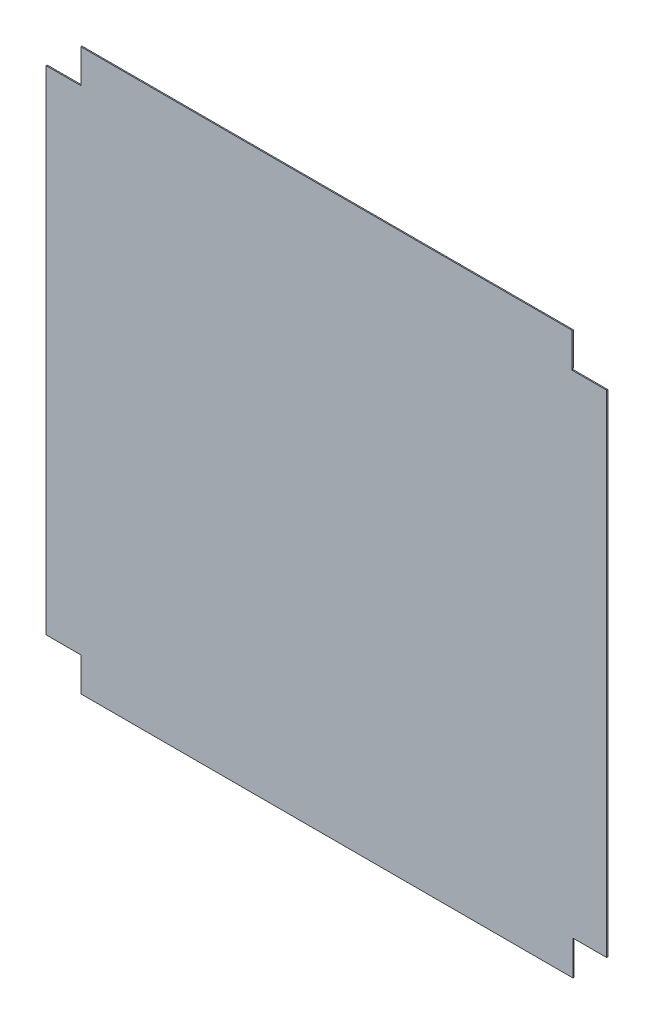
ISO-10303-21;
HEADER;
FILE_DESCRIPTION(('STEP AP214'),'2;1');
FILE_NAME('part.step','',(''),(''),'','','');
FILE_SCHEMA(('AUTOMOTIVE_DESIGN { 1 0 10303 214 1 1 1 1 }'));
ENDSEC;
DATA;
#1=APPLICATION_CONTEXT('core data for automotive mechanical design processes');
#2=APPLICATION_PROTOCOL_DEFINITION('international standard','automotive_design',2000,#1);
#3=PRODUCT_CONTEXT('',#1,'mechanical');
#4=PRODUCT('Part','Part','',(#3));
#5=PRODUCT_RELATED_PRODUCT_CATEGORY('part','',(#4));
#6=PRODUCT_DEFINITION_FORMATION('','',#4);
#7=PRODUCT_DEFINITION_CONTEXT('part definition',#1,'design');
#8=PRODUCT_DEFINITION('design','',#6,#7);
#9=PRODUCT_DEFINITION_SHAPE('','',#8);
#10=(LENGTH_UNIT() NAMED_UNIT(*) SI_UNIT(.MILLI.,.METRE.));
#11=(NAMED_UNIT(*) PLANE_ANGLE_UNIT() SI_UNIT($,.RADIAN.));
#12=(NAMED_UNIT(*) SI_UNIT($,.STERADIAN.) SOLID_ANGLE_UNIT());
#13=UNCERTAINTY_MEASURE_WITH_UNIT(LENGTH_MEASURE(1.E-05),#10,'distance_accuracy_value','');
#14=(GEOMETRIC_REPRESENTATION_CONTEXT(3) GLOBAL_UNCERTAINTY_ASSIGNED_CONTEXT((#13)) GLOBAL_UNIT_ASSIGNED_CONTEXT((#10,
#11,#12)) REPRESENTATION_CONTEXT('',''));
#15=CARTESIAN_POINT('',(0.,0.,0.));
#16=DIRECTION('',(0.,0.,1.));
#17=DIRECTION('',(1.,0.,0.));
#18=AXIS2_PLACEMENT_3D('',#15,#16,#17);
#19=CARTESIAN_POINT('',(0.,0.,-1.));
#20=DIRECTION('',(0.,0.,1.));
#21=DIRECTION('',(1.,0.,0.));
#22=AXIS2_PLACEMENT_3D('',#19,#20,#21);
#23=PLANE('',#22);
#24=DIRECTION('',(-0.0151817906491979,-0.999884749975058,0.));
#25=VECTOR('',#24,1.);
#26=CARTESIAN_POINT('',(221.792893218813,223.705846737715,-1.00000000000007));
#27=LINE('',#26,#25);
#28=CARTESIAN_POINT('',(221.792893218813,223.705846737715,-1.00000000000007));
#29=VERTEX_POINT('',#28);
#30=CARTESIAN_POINT('',(221.7634,221.7634,-0.99999999999997));
#31=VERTEX_POINT('',#30);
#32=EDGE_CURVE('E308',#29,#31,#27,.T.);
#33=ORIENTED_EDGE('',*,*,#32,.T.);
#34=CARTESIAN_POINT('',(221.792893218813,221.792893218813,-0.999999999999905));
#35=CARTESIAN_POINT('',(221.7634,221.7634,-1.));
#36=B_SPLINE_CURVE_WITH_KNOTS('',1,(#34,#35),.UNSPECIFIED.,.F.,.F.,(2,2),(0.,
0.0107021136878942),.UNSPECIFIED.);
#37=CARTESIAN_POINT('',(221.792893218813,221.792893218813,-0.999999999999905));
#38=VERTEX_POINT('',#37);
#39=EDGE_CURVE('E250',#38,#31,#36,.T.);
#40=ORIENTED_EDGE('',*,*,#39,.F.);
#41=CARTESIAN_POINT('',(223.705846737715,221.792893218813,-0.999999999999904));
#42=CARTESIAN_POINT('',(221.792893218813,221.792893218813,-0.999999999999905));
#43=B_SPLINE_CURVE_WITH_KNOTS('',1,(#41,#42),.UNSPECIFIED.,.F.,.F.,(2,2),(0.509163549271259,1.),.UNSPECIFIED.);
#44=CARTESIAN_POINT('',(223.705846737715,221.792893218813,-0.999999999999973));
#45=VERTEX_POINT('',#44);
#46=EDGE_CURVE('E241',#45,#38,#43,.T.);
#47=ORIENTED_EDGE('',*,*,#46,.F.);
#48=DIRECTION('',(1.,0.,0.));
#49=VECTOR('',#48,1.);
#50=CARTESIAN_POINT('',(222.969246737715,221.792893218813,-0.999999999999973));
#51=LINE('',#50,#49);
#52=CARTESIAN_POINT('',(252.969246737715,221.792893218814,-0.999999999999862));
#53=VERTEX_POINT('',#52);
#54=EDGE_CURVE('E323',#45,#53,#51,.T.);
#55=ORIENTED_EDGE('',*,*,#54,.T.);
#56=DIRECTION('',(0.,1.,0.));
#57=VECTOR('',#56,1.);
#58=CARTESIAN_POINT('',(252.969246737715,222.5,-0.999999999999779));
#59=LINE('',#58,#57);
#60=CARTESIAN_POINT('',(252.969246737714,-221.7634,-0.999999999999862));
#61=VERTEX_POINT('',#60);
#62=EDGE_CURVE('E326',#61,#53,#59,.T.);
#63=ORIENTED_EDGE('',*,*,#62,.F.);
#64=DIRECTION('',(-1.,0.,0.));
#65=VECTOR('',#64,1.);
#66=CARTESIAN_POINT('',(223.705846737715,-221.7634,-1.00000000000004));
#67=LINE('',#66,#65);
#68=CARTESIAN_POINT('',(222.5,-221.7634,-1.00000000000004));
#69=VERTEX_POINT('',#68);
#70=EDGE_CURVE('E394',#61,#69,#67,.T.);
#71=ORIENTED_EDGE('',*,*,#70,.T.);
#72=DIRECTION('',(0.,-1.,0.));
#73=VECTOR('',#72,1.);
#74=CARTESIAN_POINT('',(222.5,-221.7634,-1.00000000000004));
#75=LINE('',#74,#73);
#76=CARTESIAN_POINT('',(222.5,-252.969246737715,-0.999999999999807));
#77=VERTEX_POINT('',#76);
#78=EDGE_CURVE('E369',#69,#77,#75,.T.);
#79=ORIENTED_EDGE('',*,*,#78,.T.);
#80=DIRECTION('',(1.,0.,0.));
#81=VECTOR('',#80,1.);
#82=CARTESIAN_POINT('',(222.5,-252.969246737715,-0.999999999999807));
#83=LINE('',#82,#81);
#84=CARTESIAN_POINT('',(-221.7634,-252.969246737715,-0.999999999999751));
#85=VERTEX_POINT('',#84);
#86=EDGE_CURVE('E375',#85,#77,#83,.T.);
#87=ORIENTED_EDGE('',*,*,#86,.F.);
#88=DIRECTION('',(0.,1.,0.));
#89=VECTOR('',#88,1.);
#90=CARTESIAN_POINT('',(-221.7634,-223.705846737715,-1.00000000000004));
#91=LINE('',#90,#89);
#92=CARTESIAN_POINT('',(-221.7634,-222.5,-1.00000000000007));
#93=VERTEX_POINT('',#92);
#94=EDGE_CURVE('E360',#85,#93,#91,.T.);
#95=ORIENTED_EDGE('',*,*,#94,.T.);
#96=DIRECTION('',(-1.,0.,0.));
#97=VECTOR('',#96,1.);
#98=CARTESIAN_POINT('',(-221.7634,-222.5,-1.00000000000007));
#99=LINE('',#98,#97);
#100=CARTESIAN_POINT('',(-252.969246737715,-222.5,-0.999999999999862));
#101=VERTEX_POINT('',#100);
#102=EDGE_CURVE('E342',#93,#101,#99,.T.);
#103=ORIENTED_EDGE('',*,*,#102,.T.);
#104=DIRECTION('',(0.,-1.,0.));
#105=VECTOR('',#104,1.);
#106=CARTESIAN_POINT('',(-252.969246737715,-222.5,-0.999999999999862));
#107=LINE('',#106,#105);
#108=CARTESIAN_POINT('',(-252.969246737715,222.5,-0.999999999999862));
#109=VERTEX_POINT('',#108);
#110=EDGE_CURVE('E245',#109,#101,#107,.T.);
#111=ORIENTED_EDGE('',*,*,#110,.F.);
#112=DIRECTION('',(1.,0.,0.));
#113=VECTOR('',#112,1.);
#114=CARTESIAN_POINT('',(-223.705846737714,222.5,-1.00000000000007));
#115=LINE('',#114,#113);
#116=CARTESIAN_POINT('',(-221.7634,222.5,-1.00000000000007));
#117=VERTEX_POINT('',#116);
#118=EDGE_CURVE('E256',#109,#117,#115,.T.);
#119=ORIENTED_EDGE('',*,*,#118,.T.);
#120=DIRECTION('',(0.,1.,0.));
#121=VECTOR('',#120,1.);
#122=CARTESIAN_POINT('',(-221.7634,221.7634,-1.00000000000007));
#123=LINE('',#122,#121);
#124=CARTESIAN_POINT('',(-221.7634,252.969246737715,-0.99999999999989));
#125=VERTEX_POINT('',#124);
#126=EDGE_CURVE('E315',#117,#125,#123,.T.);
#127=ORIENTED_EDGE('',*,*,#126,.T.);
#128=DIRECTION('',(-1.,0.,0.));
#129=VECTOR('',#128,1.);
#130=CARTESIAN_POINT('',(-221.7634,252.969246737715,-0.99999999999989));
#131=LINE('',#130,#129);
#132=CARTESIAN_POINT('',(221.792893218813,252.969246737715,-0.999999999999696));
#133=VERTEX_POINT('',#132);
#134=EDGE_CURVE('E405',#133,#125,#131,.T.);
#135=ORIENTED_EDGE('',*,*,#134,.F.);
#136=DIRECTION('',(0.,1.,0.));
#137=VECTOR('',#136,1.);
#138=CARTESIAN_POINT('',(221.792893218813,222.969246737715,-0.99999999999989));
#139=LINE('',#138,#137);
#140=EDGE_CURVE('E413',#29,#133,#139,.T.);
#141=ORIENTED_EDGE('',*,*,#140,.F.);
#142=EDGE_LOOP('',(#33,#40,#47,#55,#63,#71,#79,#87,#95,#103,#111,#119,#127,#135,#141));
#143=FACE_BOUND('',#142,.T.);
#144=ADVANCED_FACE('F116',(#143),#23,.F.);
#145=CARTESIAN_POINT('',(0.,0.,0.));
#146=DIRECTION('',(0.,0.,1.));
#147=DIRECTION('',(1.,0.,0.));
#148=AXIS2_PLACEMENT_3D('',#145,#146,#147);
#149=PLANE('',#148);
#150=CARTESIAN_POINT('',(221.792893218813,221.792893218813,0.));
#151=CARTESIAN_POINT('',(221.7634,221.7634,0.));
#152=B_SPLINE_CURVE_WITH_KNOTS('',1,(#150,#151),.UNSPECIFIED.,.F.,.F.,(2,2),(0.,
0.0107021136878942),.UNSPECIFIED.);
#153=CARTESIAN_POINT('',(221.792893218813,221.792893218813,0.));
#154=VERTEX_POINT('',#153);
#155=CARTESIAN_POINT('',(221.7634,221.7634,0.));
#156=VERTEX_POINT('',#155);
#157=EDGE_CURVE('E231',#154,#156,#152,.T.);
#158=ORIENTED_EDGE('',*,*,#157,.T.);
#159=DIRECTION('',(-0.0151817906491979,-0.999884749975058,0.));
#160=VECTOR('',#159,1.);
#161=CARTESIAN_POINT('',(221.792893218813,223.705846737715,0.));
#162=LINE('',#161,#160);
#163=CARTESIAN_POINT('',(221.792893218813,223.705846737715,0.));
#164=VERTEX_POINT('',#163);
#165=EDGE_CURVE('E318',#164,#156,#162,.T.);
#166=ORIENTED_EDGE('',*,*,#165,.F.);
#167=DIRECTION('',(0.,1.,0.));
#168=VECTOR('',#167,1.);
#169=CARTESIAN_POINT('',(221.792893218813,221.969246737714,0.));
#170=LINE('',#169,#168);
#171=CARTESIAN_POINT('',(221.792893218813,252.969246737715,3.05311331771918E-13));
#172=VERTEX_POINT('',#171);
#173=EDGE_CURVE('E401',#164,#172,#170,.T.);
#174=ORIENTED_EDGE('',*,*,#173,.T.);
#175=DIRECTION('',(-1.,0.,0.));
#176=VECTOR('',#175,1.);
#177=CARTESIAN_POINT('',(-221.7634,252.969246737715,1.11022302462516E-13));
#178=LINE('',#177,#176);
#179=CARTESIAN_POINT('',(-221.7634,252.969246737715,1.11022302462516E-13));
#180=VERTEX_POINT('',#179);
#181=EDGE_CURVE('E398',#172,#180,#178,.T.);
#182=ORIENTED_EDGE('',*,*,#181,.T.);
#183=DIRECTION('',(0.,1.,0.));
#184=VECTOR('',#183,1.);
#185=CARTESIAN_POINT('',(-221.7634,222.734623368857,0.));
#186=LINE('',#185,#184);
#187=CARTESIAN_POINT('',(-221.7634,222.5,0.));
#188=VERTEX_POINT('',#187);
#189=EDGE_CURVE('E320',#188,#180,#186,.T.);
#190=ORIENTED_EDGE('',*,*,#189,.F.);
#191=DIRECTION('',(-1.,0.,0.));
#192=VECTOR('',#191,1.);
#193=CARTESIAN_POINT('',(-222.734623368857,222.5,-8.38738800634786E-12));
#194=LINE('',#193,#192);
#195=CARTESIAN_POINT('',(-252.969246737715,222.5,1.38777878078145E-13));
#196=VERTEX_POINT('',#195);
#197=EDGE_CURVE('E133',#196,#188,#194,.F.);
#198=ORIENTED_EDGE('',*,*,#197,.F.);
#199=DIRECTION('',(0.,-1.,0.));
#200=VECTOR('',#199,1.);
#201=CARTESIAN_POINT('',(-252.969246737715,-222.5,1.38777878078145E-13));
#202=LINE('',#201,#200);
#203=CARTESIAN_POINT('',(-252.969246737715,-222.5,1.38777878078145E-13));
#204=VERTEX_POINT('',#203);
#205=EDGE_CURVE('E350',#196,#204,#202,.T.);
#206=ORIENTED_EDGE('',*,*,#205,.T.);
#207=DIRECTION('',(-1.,0.,0.));
#208=VECTOR('',#207,1.);
#209=CARTESIAN_POINT('',(-222.734623368857,-222.5,-8.38738800634786E-12));
#210=LINE('',#209,#208);
#211=CARTESIAN_POINT('',(-221.7634,-222.5,-8.38738800634786E-12));
#212=VERTEX_POINT('',#211);
#213=EDGE_CURVE('E340',#212,#204,#210,.T.);
#214=ORIENTED_EDGE('',*,*,#213,.F.);
#215=DIRECTION('',(0.,1.,0.));
#216=VECTOR('',#215,1.);
#217=CARTESIAN_POINT('',(-221.7634,-222.734623368857,-1.3389896830196E-12));
#218=LINE('',#217,#216);
#219=CARTESIAN_POINT('',(-221.7634,-252.969246737715,2.4980018054066E-13));
#220=VERTEX_POINT('',#219);
#221=EDGE_CURVE('E347',#220,#212,#218,.T.);
#222=ORIENTED_EDGE('',*,*,#221,.F.);
#223=DIRECTION('',(1.,0.,0.));
#224=VECTOR('',#223,1.);
#225=CARTESIAN_POINT('',(222.5,-252.969246737715,1.94289029309402E-13));
#226=LINE('',#225,#224);
#227=CARTESIAN_POINT('',(222.5,-252.969246737715,1.94289029309402E-13));
#228=VERTEX_POINT('',#227);
#229=EDGE_CURVE('E358',#220,#228,#226,.T.);
#230=ORIENTED_EDGE('',*,*,#229,.T.);
#231=DIRECTION('',(0.,1.,0.));
#232=VECTOR('',#231,1.);
#233=CARTESIAN_POINT('',(222.5,-222.734623368857,-1.3389896830196E-12));
#234=LINE('',#233,#232);
#235=CARTESIAN_POINT('',(222.5,-221.7634,-1.3389896830196E-12));
#236=VERTEX_POINT('',#235);
#237=EDGE_CURVE('E357',#236,#228,#234,.F.);
#238=ORIENTED_EDGE('',*,*,#237,.F.);
#239=DIRECTION('',(-1.,0.,0.));
#240=VECTOR('',#239,1.);
#241=CARTESIAN_POINT('',(222.734623368857,-221.7634,0.));
#242=LINE('',#241,#240);
#243=CARTESIAN_POINT('',(252.969246737714,-221.7634,1.38777878078145E-13));
#244=VERTEX_POINT('',#243);
#245=EDGE_CURVE('E397',#244,#236,#242,.T.);
#246=ORIENTED_EDGE('',*,*,#245,.F.);
#247=DIRECTION('',(0.,1.,0.));
#248=VECTOR('',#247,1.);
#249=CARTESIAN_POINT('',(252.969246737715,222.5,2.22044604925031E-13));
#250=LINE('',#249,#248);
#251=CARTESIAN_POINT('',(252.969246737715,221.792893218814,1.94289029309402E-13));
#252=VERTEX_POINT('',#251);
#253=EDGE_CURVE('E370',#244,#252,#250,.T.);
#254=ORIENTED_EDGE('',*,*,#253,.T.);
#255=DIRECTION('',(1.,0.,0.));
#256=VECTOR('',#255,1.);
#257=CARTESIAN_POINT('',(221.969246737712,221.792893218813,0.));
#258=LINE('',#257,#256);
#259=CARTESIAN_POINT('',(223.705846737715,221.792893218813,0.));
#260=VERTEX_POINT('',#259);
#261=EDGE_CURVE('E234',#260,#252,#258,.T.);
#262=ORIENTED_EDGE('',*,*,#261,.F.);
#263=CARTESIAN_POINT('',(223.705846737715,221.792893218813,0.));
#264=CARTESIAN_POINT('',(221.792893218813,221.792893218813,0.));
#265=B_SPLINE_CURVE_WITH_KNOTS('',1,(#263,#264),.UNSPECIFIED.,.F.,.F.,(2,2),(0.509163549271259,
1.),.UNSPECIFIED.);
#266=EDGE_CURVE('E227',#260,#154,#265,.T.);
#267=ORIENTED_EDGE('',*,*,#266,.T.);
#268=EDGE_LOOP('',(#158,#166,#174,#182,#190,#198,#206,#214,#222,#230,#238,#246,#254,#262,#267));
#269=FACE_BOUND('',#268,.T.);
#270=ADVANCED_FACE('F118',(#269),#149,.T.);
#271=CARTESIAN_POINT('',(-221.7634,221.7634,-1.00000000000007));
#272=DIRECTION('',(-1.,0.,0.));
#273=DIRECTION('',(0.,1.,0.));
#274=AXIS2_PLACEMENT_3D('',#271,#272,#273);
#275=PLANE('',#274);
#276=ORIENTED_EDGE('',*,*,#126,.F.);
#277=DIRECTION('',(0.,0.,1.));
#278=VECTOR('',#277,1.);
#279=CARTESIAN_POINT('',(-221.7634,222.5,-1.));
#280=LINE('',#279,#278);
#281=EDGE_CURVE('E13',#117,#188,#280,.T.);
#282=ORIENTED_EDGE('',*,*,#281,.T.);
#283=ORIENTED_EDGE('',*,*,#189,.T.);
#284=DIRECTION('',(0.,0.,-1.));
#285=VECTOR('',#284,1.);
#286=CARTESIAN_POINT('',(-221.7634,252.969246737715,1.11022302462516E-13));
#287=LINE('',#286,#285);
#288=EDGE_CURVE('E402',#180,#125,#287,.T.);
#289=ORIENTED_EDGE('',*,*,#288,.T.);
#290=EDGE_LOOP('',(#276,#282,#283,#289));
#291=FACE_BOUND('',#290,.T.);
#292=ADVANCED_FACE('F290',(#291),#275,.T.);
#293=CARTESIAN_POINT('',(221.792893218813,223.705846737715,-1.00000000000007));
#294=DIRECTION('',(0.999884749975058,-0.0151817906491979,0.));
#295=DIRECTION('',(0.,0.,1.));
#296=AXIS2_PLACEMENT_3D('',#293,#294,#295);
#297=PLANE('',#296);
#298=ORIENTED_EDGE('',*,*,#165,.T.);
#299=DIRECTION('',(0.,0.,1.));
#300=VECTOR('',#299,1.);
#301=CARTESIAN_POINT('',(221.7634,221.7634,-1.00000000000007));
#302=LINE('',#301,#300);
#303=EDGE_CURVE('E120',#156,#31,#302,.F.);
#304=ORIENTED_EDGE('',*,*,#303,.T.);
#305=ORIENTED_EDGE('',*,*,#32,.F.);
#306=CARTESIAN_POINT('',(221.792893218813,223.705846737715,0.));
#307=DIRECTION('',(0.,0.,-1.));
#308=VECTOR('',#307,1.);
#309=LINE('',#306,#308);
#310=EDGE_CURVE('E141',#164,#29,#309,.T.);
#311=ORIENTED_EDGE('',*,*,#310,.F.);
#312=EDGE_LOOP('',(#298,#304,#305,#311));
#313=FACE_BOUND('',#312,.T.);
#314=ADVANCED_FACE('F280',(#313),#297,.T.);
#315=CARTESIAN_POINT('',(-221.7634,252.969246737715,1.11022302462516E-13));
#316=DIRECTION('',(0.,-1.,0.));
#317=DIRECTION('',(0.,0.,-1.));
#318=AXIS2_PLACEMENT_3D('',#315,#316,#317);
#319=PLANE('',#318);
#320=ORIENTED_EDGE('',*,*,#181,.F.);
#321=DIRECTION('',(0.,0.,-1.));
#322=VECTOR('',#321,1.);
#323=CARTESIAN_POINT('',(221.792893218813,252.969246737715,1.11022302462516E-13));
#324=LINE('',#323,#322);
#325=EDGE_CURVE('E396',#172,#133,#324,.T.);
#326=ORIENTED_EDGE('',*,*,#325,.T.);
#327=ORIENTED_EDGE('',*,*,#134,.T.);
#328=ORIENTED_EDGE('',*,*,#288,.F.);
#329=EDGE_LOOP('',(#320,#326,#327,#328));
#330=FACE_BOUND('',#329,.T.);
#331=ADVANCED_FACE('F289',(#330),#319,.F.);
#332=CARTESIAN_POINT('',(221.792893218813,222.969246737715,-0.99999999999989));
#333=DIRECTION('',(-1.,0.,0.));
#334=DIRECTION('',(0.,-1.,0.));
#335=AXIS2_PLACEMENT_3D('',#332,#333,#334);
#336=PLANE('',#335);
#337=ORIENTED_EDGE('',*,*,#325,.F.);
#338=ORIENTED_EDGE('',*,*,#173,.F.);
#339=ORIENTED_EDGE('',*,*,#310,.T.);
#340=ORIENTED_EDGE('',*,*,#140,.T.);
#341=EDGE_LOOP('',(#337,#338,#339,#340));
#342=FACE_BOUND('',#341,.T.);
#343=ADVANCED_FACE('F297',(#342),#336,.F.);
#344=CARTESIAN_POINT('',(223.705846737715,-221.7634,-1.00000000000004));
#345=DIRECTION('',(0.,-1.,0.));
#346=DIRECTION('',(-1.,0.,0.));
#347=AXIS2_PLACEMENT_3D('',#344,#345,#346);
#348=PLANE('',#347);
#349=DIRECTION('',(0.,0.,1.));
#350=VECTOR('',#349,1.);
#351=CARTESIAN_POINT('',(222.5,-221.7634,-1.00000000000003));
#352=LINE('',#351,#350);
#353=EDGE_CURVE('E329',#69,#236,#352,.T.);
#354=ORIENTED_EDGE('',*,*,#353,.F.);
#355=ORIENTED_EDGE('',*,*,#70,.F.);
#356=DIRECTION('',(0.,0.,-1.));
#357=VECTOR('',#356,1.);
#358=CARTESIAN_POINT('',(252.969246737714,-221.7634,1.38777878078145E-13));
#359=LINE('',#358,#357);
#360=EDGE_CURVE('E377',#244,#61,#359,.T.);
#361=ORIENTED_EDGE('',*,*,#360,.F.);
#362=ORIENTED_EDGE('',*,*,#245,.T.);
#363=EDGE_LOOP('',(#354,#355,#361,#362));
#364=FACE_BOUND('',#363,.T.);
#365=ADVANCED_FACE('F301',(#364),#348,.T.);
#366=CARTESIAN_POINT('',(252.969246737715,222.5,2.22044604925031E-13));
#367=DIRECTION('',(-1.,0.,0.));
#368=DIRECTION('',(0.,0.,1.));
#369=AXIS2_PLACEMENT_3D('',#366,#367,#368);
#370=PLANE('',#369);
#371=DIRECTION('',(0.,0.,-1.));
#372=VECTOR('',#371,1.);
#373=CARTESIAN_POINT('',(252.969246737715,221.792893218814,2.22044604925031E-13));
#374=LINE('',#373,#372);
#375=EDGE_CURVE('E328',#252,#53,#374,.T.);
#376=ORIENTED_EDGE('',*,*,#375,.F.);
#377=ORIENTED_EDGE('',*,*,#253,.F.);
#378=ORIENTED_EDGE('',*,*,#360,.T.);
#379=ORIENTED_EDGE('',*,*,#62,.T.);
#380=EDGE_LOOP('',(#376,#377,#378,#379));
#381=FACE_BOUND('',#380,.T.);
#382=ADVANCED_FACE('F425',(#381),#370,.F.);
#383=CARTESIAN_POINT('',(222.969246737715,221.792893218813,-0.999999999999973));
#384=DIRECTION('',(0.,1.,0.));
#385=DIRECTION('',(-1.,0.,0.));
#386=AXIS2_PLACEMENT_3D('',#383,#384,#385);
#387=PLANE('',#386);
#388=ORIENTED_EDGE('',*,*,#261,.T.);
#389=ORIENTED_EDGE('',*,*,#375,.T.);
#390=ORIENTED_EDGE('',*,*,#54,.F.);
#391=ORIENTED_EDGE('',*,*,#46,.T.);
#392=DIRECTION('',(0.,0.,-1.));
#393=VECTOR('',#392,1.);
#394=CARTESIAN_POINT('',(221.792893218813,221.792893218813,0.));
#395=LINE('',#394,#393);
#396=EDGE_CURVE('E236',#154,#38,#395,.T.);
#397=ORIENTED_EDGE('',*,*,#396,.F.);
#398=ORIENTED_EDGE('',*,*,#266,.F.);
#399=EDGE_LOOP('',(#388,#389,#390,#391,#397,#398));
#400=FACE_BOUND('',#399,.T.);
#401=ADVANCED_FACE('F239',(#400),#387,.T.);
#402=CARTESIAN_POINT('',(-221.7634,-223.705846737715,-1.00000000000004));
#403=DIRECTION('',(-1.,0.,0.));
#404=DIRECTION('',(0.,1.,0.));
#405=AXIS2_PLACEMENT_3D('',#402,#403,#404);
#406=PLANE('',#405);
#407=DIRECTION('',(0.,0.,1.));
#408=VECTOR('',#407,1.);
#409=CARTESIAN_POINT('',(-221.7634,-222.5,-1.));
#410=LINE('',#409,#408);
#411=EDGE_CURVE('E125',#93,#212,#410,.T.);
#412=ORIENTED_EDGE('',*,*,#411,.F.);
#413=ORIENTED_EDGE('',*,*,#94,.F.);
#414=DIRECTION('',(0.,0.,-1.));
#415=VECTOR('',#414,1.);
#416=CARTESIAN_POINT('',(-221.7634,-252.969246737715,2.4980018054066E-13));
#417=LINE('',#416,#415);
#418=EDGE_CURVE('E356',#220,#85,#417,.T.);
#419=ORIENTED_EDGE('',*,*,#418,.F.);
#420=ORIENTED_EDGE('',*,*,#221,.T.);
#421=EDGE_LOOP('',(#412,#413,#419,#420));
#422=FACE_BOUND('',#421,.T.);
#423=ADVANCED_FACE('F354',(#422),#406,.T.);
#424=CARTESIAN_POINT('',(222.5,-221.7634,-1.00000000000004));
#425=DIRECTION('',(1.,0.,0.));
#426=DIRECTION('',(0.,-1.,0.));
#427=AXIS2_PLACEMENT_3D('',#424,#425,#426);
#428=PLANE('',#427);
#429=ORIENTED_EDGE('',*,*,#353,.T.);
#430=ORIENTED_EDGE('',*,*,#237,.T.);
#431=DIRECTION('',(0.,0.,-1.));
#432=VECTOR('',#431,1.);
#433=CARTESIAN_POINT('',(222.5,-252.969246737715,1.94289029309402E-13));
#434=LINE('',#433,#432);
#435=EDGE_CURVE('E362',#228,#77,#434,.T.);
#436=ORIENTED_EDGE('',*,*,#435,.T.);
#437=ORIENTED_EDGE('',*,*,#78,.F.);
#438=EDGE_LOOP('',(#429,#430,#436,#437));
#439=FACE_BOUND('',#438,.T.);
#440=ADVANCED_FACE('F431',(#439),#428,.T.);
#441=CARTESIAN_POINT('',(222.5,-252.969246737715,1.94289029309402E-13));
#442=DIRECTION('',(0.,1.,0.));
#443=DIRECTION('',(0.,0.,1.));
#444=AXIS2_PLACEMENT_3D('',#441,#442,#443);
#445=PLANE('',#444);
#446=ORIENTED_EDGE('',*,*,#86,.T.);
#447=ORIENTED_EDGE('',*,*,#435,.F.);
#448=ORIENTED_EDGE('',*,*,#229,.F.);
#449=ORIENTED_EDGE('',*,*,#418,.T.);
#450=EDGE_LOOP('',(#446,#447,#448,#449));
#451=FACE_BOUND('',#450,.T.);
#452=ADVANCED_FACE('F435',(#451),#445,.F.);
#453=CARTESIAN_POINT('',(-223.705846737714,222.5,-1.00000000000007));
#454=DIRECTION('',(0.,1.,0.));
#455=DIRECTION('',(1.,0.,0.));
#456=AXIS2_PLACEMENT_3D('',#453,#454,#455);
#457=PLANE('',#456);
#458=ORIENTED_EDGE('',*,*,#118,.F.);
#459=DIRECTION('',(0.,0.,-1.));
#460=VECTOR('',#459,1.);
#461=CARTESIAN_POINT('',(-252.969246737715,222.5,1.38777878078145E-13));
#462=LINE('',#461,#460);
#463=EDGE_CURVE('E442',#196,#109,#462,.T.);
#464=ORIENTED_EDGE('',*,*,#463,.F.);
#465=ORIENTED_EDGE('',*,*,#197,.T.);
#466=ORIENTED_EDGE('',*,*,#281,.F.);
#467=EDGE_LOOP('',(#458,#464,#465,#466));
#468=FACE_BOUND('',#467,.T.);
#469=ADVANCED_FACE('F452',(#468),#457,.T.);
#470=CARTESIAN_POINT('',(-221.7634,-222.5,-1.00000000000007));
#471=DIRECTION('',(0.,-1.,0.));
#472=DIRECTION('',(-1.,0.,0.));
#473=AXIS2_PLACEMENT_3D('',#470,#471,#472);
#474=PLANE('',#473);
#475=ORIENTED_EDGE('',*,*,#411,.T.);
#476=ORIENTED_EDGE('',*,*,#213,.T.);
#477=DIRECTION('',(0.,0.,-1.));
#478=VECTOR('',#477,1.);
#479=CARTESIAN_POINT('',(-252.969246737715,-222.5,1.38777878078145E-13));
#480=LINE('',#479,#478);
#481=EDGE_CURVE('E445',#204,#101,#480,.T.);
#482=ORIENTED_EDGE('',*,*,#481,.T.);
#483=ORIENTED_EDGE('',*,*,#102,.F.);
#484=EDGE_LOOP('',(#475,#476,#482,#483));
#485=FACE_BOUND('',#484,.T.);
#486=ADVANCED_FACE('F338',(#485),#474,.T.);
#487=CARTESIAN_POINT('',(-252.969246737715,-222.5,1.38777878078145E-13));
#488=DIRECTION('',(1.,0.,0.));
#489=DIRECTION('',(0.,0.,-1.));
#490=AXIS2_PLACEMENT_3D('',#487,#488,#489);
#491=PLANE('',#490);
#492=ORIENTED_EDGE('',*,*,#110,.T.);
#493=ORIENTED_EDGE('',*,*,#481,.F.);
#494=ORIENTED_EDGE('',*,*,#205,.F.);
#495=ORIENTED_EDGE('',*,*,#463,.T.);
#496=EDGE_LOOP('',(#492,#493,#494,#495));
#497=FACE_BOUND('',#496,.T.);
#498=ADVANCED_FACE('F448',(#497),#491,.F.);
#499=CARTESIAN_POINT('',(221.792893218813,221.792893218813,0.));
#500=DIRECTION('',(0.707106781186547,-0.707106781186547,0.));
#501=DIRECTION('',(0.707106781186548,0.707106781186548,0.));
#502=AXIS2_PLACEMENT_3D('',#499,#500,#501);
#503=PLANE('',#502);
#504=ORIENTED_EDGE('',*,*,#39,.T.);
#505=ORIENTED_EDGE('',*,*,#303,.F.);
#506=ORIENTED_EDGE('',*,*,#157,.F.);
#507=ORIENTED_EDGE('',*,*,#396,.T.);
#508=EDGE_LOOP('',(#504,#505,#506,#507));
#509=FACE_BOUND('',#508,.T.);
#510=ADVANCED_FACE('F247',(#509),#503,.F.);
#511=CLOSED_SHELL('',(#144,#270,#292,#314,#331,#343,#365,#382,#401,#423,#440,#452,#469,#486,
#498,#510));
#512=MANIFOLD_SOLID_BREP('B2',#511);
#513=ADVANCED_BREP_SHAPE_REPRESENTATION('',(#18,#512),#14);
#514=SHAPE_DEFINITION_REPRESENTATION(#9,#513);
ENDSEC;
END-ISO-10303-21;
